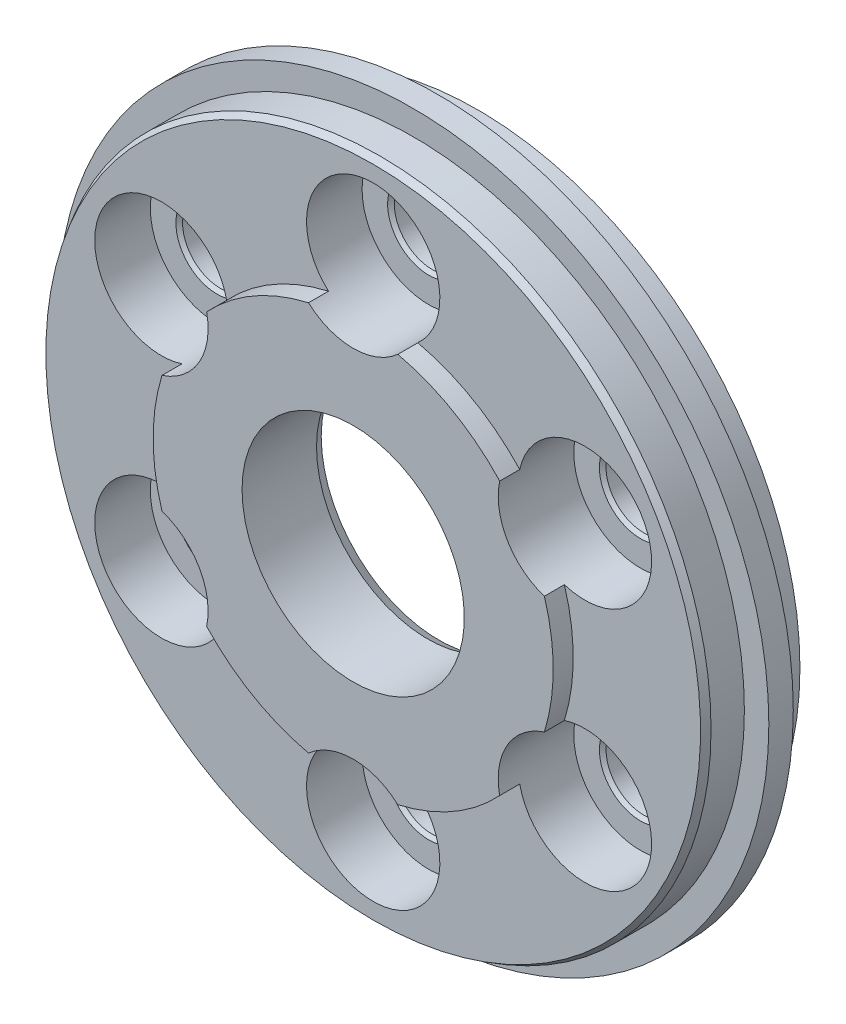
ISO-10303-21;
HEADER;
FILE_DESCRIPTION(('STEP AP214'),'2;1');
FILE_NAME('part.step','',(''),(''),'','','');
FILE_SCHEMA(('AUTOMOTIVE_DESIGN { 1 0 10303 214 1 1 1 1 }'));
ENDSEC;
DATA;
#1=APPLICATION_CONTEXT('core data for automotive mechanical design processes');
#2=APPLICATION_PROTOCOL_DEFINITION('international standard','automotive_design',2000,#1);
#3=PRODUCT_CONTEXT('',#1,'mechanical');
#4=PRODUCT('Part','Part','',(#3));
#5=PRODUCT_RELATED_PRODUCT_CATEGORY('part','',(#4));
#6=PRODUCT_DEFINITION_FORMATION('','',#4);
#7=PRODUCT_DEFINITION_CONTEXT('part definition',#1,'design');
#8=PRODUCT_DEFINITION('design','',#6,#7);
#9=PRODUCT_DEFINITION_SHAPE('','',#8);
#10=(LENGTH_UNIT() NAMED_UNIT(*) SI_UNIT(.MILLI.,.METRE.));
#11=(NAMED_UNIT(*) PLANE_ANGLE_UNIT() SI_UNIT($,.RADIAN.));
#12=(NAMED_UNIT(*) SI_UNIT($,.STERADIAN.) SOLID_ANGLE_UNIT());
#13=UNCERTAINTY_MEASURE_WITH_UNIT(LENGTH_MEASURE(1.E-05),#10,'distance_accuracy_value','');
#14=(GEOMETRIC_REPRESENTATION_CONTEXT(3) GLOBAL_UNCERTAINTY_ASSIGNED_CONTEXT((#13)) GLOBAL_UNIT_ASSIGNED_CONTEXT((#10,
#11,#12)) REPRESENTATION_CONTEXT('',''));
#15=CARTESIAN_POINT('',(0.,0.,0.));
#16=DIRECTION('',(0.,0.,1.));
#17=DIRECTION('',(1.,0.,0.));
#18=AXIS2_PLACEMENT_3D('',#15,#16,#17);
#19=CARTESIAN_POINT('',(0.,0.,5.6));
#20=DIRECTION('',(0.,0.,-1.));
#21=DIRECTION('',(-1.,0.,0.));
#22=AXIS2_PLACEMENT_3D('',#19,#20,#21);
#23=CYLINDRICAL_SURFACE('',#22,9.);
#24=DIRECTION('',(0.,0.,-1.));
#25=VECTOR('',#24,1.);
#26=CARTESIAN_POINT('',(2.00979008813039,-8.77272727272727,5.6));
#27=LINE('',#26,#25);
#28=CARTESIAN_POINT('',(2.00979008813038,-8.77272727272727,5.6));
#29=VERTEX_POINT('',#28);
#30=CARTESIAN_POINT('',(2.00979008813038,-8.77272727272727,4.7));
#31=VERTEX_POINT('',#30);
#32=EDGE_CURVE('E194',#29,#31,#27,.T.);
#33=ORIENTED_EDGE('',*,*,#32,.T.);
#34=CARTESIAN_POINT('',(0.,0.,4.7));
#35=DIRECTION('',(0.,0.,-1.));
#36=DIRECTION('',(-1.,0.,0.));
#37=AXIS2_PLACEMENT_3D('',#34,#35,#36);
#38=CIRCLE('',#37,9.);
#39=CARTESIAN_POINT('',(6.59250963458919,-6.12689290895873,4.7));
#40=VERTEX_POINT('',#39);
#41=EDGE_CURVE('E121',#31,#40,#38,.F.);
#42=ORIENTED_EDGE('',*,*,#41,.T.);
#43=DIRECTION('',(0.,0.,-1.));
#44=VECTOR('',#43,1.);
#45=CARTESIAN_POINT('',(6.59250963458919,-6.12689290895873,5.6));
#46=LINE('',#45,#44);
#47=CARTESIAN_POINT('',(6.59250963458919,-6.12689290895873,5.6));
#48=VERTEX_POINT('',#47);
#49=EDGE_CURVE('E193',#40,#48,#46,.F.);
#50=ORIENTED_EDGE('',*,*,#49,.T.);
#51=CARTESIAN_POINT('',(0.,0.,5.6));
#52=DIRECTION('',(0.,0.,-1.));
#53=DIRECTION('',(-1.,0.,0.));
#54=AXIS2_PLACEMENT_3D('',#51,#52,#53);
#55=CIRCLE('',#54,9.);
#56=EDGE_CURVE('E176',#29,#48,#55,.F.);
#57=ORIENTED_EDGE('',*,*,#56,.F.);
#58=EDGE_LOOP('',(#33,#42,#50,#57));
#59=FACE_BOUND('',#58,.T.);
#60=ADVANCED_FACE('F16',(#59),#23,.T.);
#61=CARTESIAN_POINT('',(0.,0.,5.6));
#62=DIRECTION('',(0.,0.,-1.));
#63=DIRECTION('',(-1.,0.,0.));
#64=AXIS2_PLACEMENT_3D('',#61,#62,#63);
#65=CYLINDRICAL_SURFACE('',#64,9.);
#66=DIRECTION('',(0.,0.,-1.));
#67=VECTOR('',#66,1.);
#68=CARTESIAN_POINT('',(8.60229972271959,2.64583436376853,5.6));
#69=LINE('',#68,#67);
#70=CARTESIAN_POINT('',(8.60229972271959,2.64583436376853,4.7));
#71=VERTEX_POINT('',#70);
#72=CARTESIAN_POINT('',(8.60229972271959,2.64583436376853,5.6));
#73=VERTEX_POINT('',#72);
#74=EDGE_CURVE('E308',#71,#73,#69,.F.);
#75=ORIENTED_EDGE('',*,*,#74,.T.);
#76=CARTESIAN_POINT('',(0.,0.,5.6));
#77=DIRECTION('',(0.,0.,-1.));
#78=DIRECTION('',(-1.,0.,0.));
#79=AXIS2_PLACEMENT_3D('',#76,#77,#78);
#80=CIRCLE('',#79,9.);
#81=CARTESIAN_POINT('',(8.60229972271957,-2.64583436376859,5.6));
#82=VERTEX_POINT('',#81);
#83=EDGE_CURVE('E173',#82,#73,#80,.F.);
#84=ORIENTED_EDGE('',*,*,#83,.F.);
#85=DIRECTION('',(0.,0.,-1.));
#86=VECTOR('',#85,1.);
#87=CARTESIAN_POINT('',(8.60229972271957,-2.64583436376859,5.6));
#88=LINE('',#87,#86);
#89=CARTESIAN_POINT('',(8.60229972271957,-2.64583436376859,4.7));
#90=VERTEX_POINT('',#89);
#91=EDGE_CURVE('E201',#82,#90,#88,.T.);
#92=ORIENTED_EDGE('',*,*,#91,.T.);
#93=CARTESIAN_POINT('',(0.,0.,4.7));
#94=DIRECTION('',(0.,0.,-1.));
#95=DIRECTION('',(-1.,0.,0.));
#96=AXIS2_PLACEMENT_3D('',#93,#94,#95);
#97=CIRCLE('',#96,9.);
#98=EDGE_CURVE('E187',#90,#71,#97,.F.);
#99=ORIENTED_EDGE('',*,*,#98,.T.);
#100=EDGE_LOOP('',(#75,#84,#92,#99));
#101=FACE_BOUND('',#100,.T.);
#102=ADVANCED_FACE('F310',(#101),#65,.T.);
#103=CARTESIAN_POINT('',(0.,0.,5.6));
#104=DIRECTION('',(0.,0.,-1.));
#105=DIRECTION('',(-1.,0.,0.));
#106=AXIS2_PLACEMENT_3D('',#103,#104,#105);
#107=CYLINDRICAL_SURFACE('',#106,9.);
#108=DIRECTION('',(0.,0.,-1.));
#109=VECTOR('',#108,1.);
#110=CARTESIAN_POINT('',(6.59250963458923,6.12689290895868,5.6));
#111=LINE('',#110,#109);
#112=CARTESIAN_POINT('',(6.59250963458923,6.12689290895868,5.6));
#113=VERTEX_POINT('',#112);
#114=CARTESIAN_POINT('',(6.59250963458923,6.12689290895868,4.7));
#115=VERTEX_POINT('',#114);
#116=EDGE_CURVE('E305',#113,#115,#111,.T.);
#117=ORIENTED_EDGE('',*,*,#116,.T.);
#118=CARTESIAN_POINT('',(0.,0.,4.7));
#119=DIRECTION('',(0.,0.,-1.));
#120=DIRECTION('',(-1.,0.,0.));
#121=AXIS2_PLACEMENT_3D('',#118,#119,#120);
#122=CIRCLE('',#121,9.);
#123=CARTESIAN_POINT('',(2.00979008813038,8.77272727272727,4.7));
#124=VERTEX_POINT('',#123);
#125=EDGE_CURVE('E184',#115,#124,#122,.F.);
#126=ORIENTED_EDGE('',*,*,#125,.T.);
#127=DIRECTION('',(0.,0.,-1.));
#128=VECTOR('',#127,1.);
#129=CARTESIAN_POINT('',(2.00979008813038,8.77272727272727,5.6));
#130=LINE('',#129,#128);
#131=CARTESIAN_POINT('',(2.00979008813038,8.77272727272727,5.6));
#132=VERTEX_POINT('',#131);
#133=EDGE_CURVE('E306',#124,#132,#130,.F.);
#134=ORIENTED_EDGE('',*,*,#133,.T.);
#135=CARTESIAN_POINT('',(0.,0.,5.6));
#136=DIRECTION('',(0.,0.,-1.));
#137=DIRECTION('',(-1.,0.,0.));
#138=AXIS2_PLACEMENT_3D('',#135,#136,#137);
#139=CIRCLE('',#138,9.);
#140=EDGE_CURVE('E170',#113,#132,#139,.F.);
#141=ORIENTED_EDGE('',*,*,#140,.F.);
#142=EDGE_LOOP('',(#117,#126,#134,#141));
#143=FACE_BOUND('',#142,.T.);
#144=ADVANCED_FACE('F485',(#143),#107,.T.);
#145=CARTESIAN_POINT('',(0.,0.,5.6));
#146=DIRECTION('',(0.,0.,-1.));
#147=DIRECTION('',(-1.,0.,0.));
#148=AXIS2_PLACEMENT_3D('',#145,#146,#147);
#149=CYLINDRICAL_SURFACE('',#148,9.);
#150=DIRECTION('',(0.,0.,-1.));
#151=VECTOR('',#150,1.);
#152=CARTESIAN_POINT('',(-6.5925096345892,6.12689290895872,5.6));
#153=LINE('',#152,#151);
#154=CARTESIAN_POINT('',(-6.5925096345892,6.12689290895872,4.7));
#155=VERTEX_POINT('',#154);
#156=CARTESIAN_POINT('',(-6.5925096345892,6.12689290895872,5.6));
#157=VERTEX_POINT('',#156);
#158=EDGE_CURVE('E300',#155,#157,#153,.F.);
#159=ORIENTED_EDGE('',*,*,#158,.T.);
#160=CARTESIAN_POINT('',(0.,0.,5.6));
#161=DIRECTION('',(0.,0.,-1.));
#162=DIRECTION('',(-1.,0.,0.));
#163=AXIS2_PLACEMENT_3D('',#160,#161,#162);
#164=CIRCLE('',#163,9.);
#165=CARTESIAN_POINT('',(-2.00979008813038,8.77272727272727,5.6));
#166=VERTEX_POINT('',#165);
#167=EDGE_CURVE('E167',#166,#157,#164,.F.);
#168=ORIENTED_EDGE('',*,*,#167,.F.);
#169=DIRECTION('',(0.,0.,-1.));
#170=VECTOR('',#169,1.);
#171=CARTESIAN_POINT('',(-2.00979008813038,8.77272727272727,5.6));
#172=LINE('',#171,#170);
#173=CARTESIAN_POINT('',(-2.00979008813038,8.77272727272727,4.7));
#174=VERTEX_POINT('',#173);
#175=EDGE_CURVE('E303',#166,#174,#172,.T.);
#176=ORIENTED_EDGE('',*,*,#175,.T.);
#177=CARTESIAN_POINT('',(0.,0.,4.7));
#178=DIRECTION('',(0.,0.,-1.));
#179=DIRECTION('',(-1.,0.,0.));
#180=AXIS2_PLACEMENT_3D('',#177,#178,#179);
#181=CIRCLE('',#180,9.);
#182=EDGE_CURVE('E181',#174,#155,#181,.F.);
#183=ORIENTED_EDGE('',*,*,#182,.T.);
#184=EDGE_LOOP('',(#159,#168,#176,#183));
#185=FACE_BOUND('',#184,.T.);
#186=ADVANCED_FACE('F481',(#185),#149,.T.);
#187=CARTESIAN_POINT('',(0.,0.,5.6));
#188=DIRECTION('',(0.,0.,-1.));
#189=DIRECTION('',(-1.,0.,0.));
#190=AXIS2_PLACEMENT_3D('',#187,#188,#189);
#191=CYLINDRICAL_SURFACE('',#190,9.);
#192=DIRECTION('',(0.,0.,-1.));
#193=VECTOR('',#192,1.);
#194=CARTESIAN_POINT('',(-8.60229972271958,2.64583436376856,5.6));
#195=LINE('',#194,#193);
#196=CARTESIAN_POINT('',(-8.60229972271958,2.64583436376856,5.6));
#197=VERTEX_POINT('',#196);
#198=CARTESIAN_POINT('',(-8.60229972271958,2.64583436376856,4.7));
#199=VERTEX_POINT('',#198);
#200=EDGE_CURVE('E109',#197,#199,#195,.T.);
#201=ORIENTED_EDGE('',*,*,#200,.T.);
#202=CARTESIAN_POINT('',(0.,0.,4.7));
#203=DIRECTION('',(0.,0.,-1.));
#204=DIRECTION('',(-1.,0.,0.));
#205=AXIS2_PLACEMENT_3D('',#202,#203,#204);
#206=CIRCLE('',#205,9.);
#207=CARTESIAN_POINT('',(-8.60229972271959,-2.64583436376856,4.7));
#208=VERTEX_POINT('',#207);
#209=EDGE_CURVE('E179',#199,#208,#206,.F.);
#210=ORIENTED_EDGE('',*,*,#209,.T.);
#211=DIRECTION('',(0.,0.,-1.));
#212=VECTOR('',#211,1.);
#213=CARTESIAN_POINT('',(-8.60229972271958,-2.64583436376856,5.6));
#214=LINE('',#213,#212);
#215=CARTESIAN_POINT('',(-8.60229972271959,-2.64583436376856,5.6));
#216=VERTEX_POINT('',#215);
#217=EDGE_CURVE('E124',#208,#216,#214,.F.);
#218=ORIENTED_EDGE('',*,*,#217,.T.);
#219=CARTESIAN_POINT('',(0.,0.,5.6));
#220=DIRECTION('',(0.,0.,-1.));
#221=DIRECTION('',(-1.,0.,0.));
#222=AXIS2_PLACEMENT_3D('',#219,#220,#221);
#223=CIRCLE('',#222,9.);
#224=EDGE_CURVE('E164',#197,#216,#223,.F.);
#225=ORIENTED_EDGE('',*,*,#224,.F.);
#226=EDGE_LOOP('',(#201,#210,#218,#225));
#227=FACE_BOUND('',#226,.T.);
#228=ADVANCED_FACE('F478',(#227),#191,.T.);
#229=CARTESIAN_POINT('',(0.,0.,5.6));
#230=DIRECTION('',(0.,0.,-1.));
#231=DIRECTION('',(-1.,0.,0.));
#232=AXIS2_PLACEMENT_3D('',#229,#230,#231);
#233=CYLINDRICAL_SURFACE('',#232,9.);
#234=DIRECTION('',(0.,0.,-1.));
#235=VECTOR('',#234,1.);
#236=CARTESIAN_POINT('',(-2.00979008813037,-8.77272727272727,5.6));
#237=LINE('',#236,#235);
#238=CARTESIAN_POINT('',(-2.00979008813038,-8.77272727272727,4.7));
#239=VERTEX_POINT('',#238);
#240=CARTESIAN_POINT('',(-2.00979008813038,-8.77272727272727,5.6));
#241=VERTEX_POINT('',#240);
#242=EDGE_CURVE('E108',#239,#241,#237,.F.);
#243=ORIENTED_EDGE('',*,*,#242,.T.);
#244=CARTESIAN_POINT('',(0.,0.,5.6));
#245=DIRECTION('',(0.,0.,-1.));
#246=DIRECTION('',(-1.,0.,0.));
#247=AXIS2_PLACEMENT_3D('',#244,#245,#246);
#248=CIRCLE('',#247,9.);
#249=CARTESIAN_POINT('',(-6.59250963458921,-6.1268929089587,5.6));
#250=VERTEX_POINT('',#249);
#251=EDGE_CURVE('E106',#250,#241,#248,.F.);
#252=ORIENTED_EDGE('',*,*,#251,.F.);
#253=DIRECTION('',(0.,0.,-1.));
#254=VECTOR('',#253,1.);
#255=CARTESIAN_POINT('',(-6.59250963458921,-6.12689290895871,5.6));
#256=LINE('',#255,#254);
#257=CARTESIAN_POINT('',(-6.59250963458921,-6.1268929089587,4.7));
#258=VERTEX_POINT('',#257);
#259=EDGE_CURVE('E34',#250,#258,#256,.T.);
#260=ORIENTED_EDGE('',*,*,#259,.T.);
#261=CARTESIAN_POINT('',(0.,0.,4.7));
#262=DIRECTION('',(0.,0.,-1.));
#263=DIRECTION('',(-1.,0.,0.));
#264=AXIS2_PLACEMENT_3D('',#261,#262,#263);
#265=CIRCLE('',#264,9.);
#266=EDGE_CURVE('E103',#258,#239,#265,.F.);
#267=ORIENTED_EDGE('',*,*,#266,.T.);
#268=EDGE_LOOP('',(#243,#252,#260,#267));
#269=FACE_BOUND('',#268,.T.);
#270=ADVANCED_FACE('F102',(#269),#233,.T.);
#271=CARTESIAN_POINT('',(0.,0.,4.39999999989637));
#272=DIRECTION('',(0.,0.,-1.));
#273=DIRECTION('',(0.,1.,0.));
#274=AXIS2_PLACEMENT_3D('',#271,#272,#273);
#275=CONICAL_SURFACE('',#274,14.8999999998205,0.523598775000003);
#276=CARTESIAN_POINT('',(0.,0.,4.7));
#277=DIRECTION('',(0.,0.,-1.));
#278=DIRECTION('',(0.,1.,0.));
#279=AXIS2_PLACEMENT_3D('',#276,#277,#278);
#280=CIRCLE('',#279,14.7267949192431);
#281=CARTESIAN_POINT('',(0.,14.7267949192431,4.7));
#282=VERTEX_POINT('',#281);
#283=EDGE_CURVE('E19',#282,#282,#280,.T.);
#284=ORIENTED_EDGE('',*,*,#283,.T.);
#285=EDGE_LOOP('',(#284));
#286=FACE_BOUND('',#285,.T.);
#287=CARTESIAN_POINT('',(0.,0.,4.4));
#288=DIRECTION('',(0.,0.,1.));
#289=DIRECTION('',(1.,0.,0.));
#290=AXIS2_PLACEMENT_3D('',#287,#288,#289);
#291=CIRCLE('',#290,14.9);
#292=CARTESIAN_POINT('',(14.9,0.,4.4));
#293=VERTEX_POINT('',#292);
#294=EDGE_CURVE('E159',#293,#293,#291,.F.);
#295=ORIENTED_EDGE('',*,*,#294,.F.);
#296=EDGE_LOOP('',(#295));
#297=FACE_BOUND('',#296,.T.);
#298=ADVANCED_FACE('F472',(#286,#297),#275,.T.);
#299=CARTESIAN_POINT('',(0.,0.,4.7));
#300=DIRECTION('',(0.,0.,-1.));
#301=DIRECTION('',(-1.,0.,0.));
#302=AXIS2_PLACEMENT_3D('',#299,#300,#301);
#303=PLANE('',#302);
#304=CARTESIAN_POINT('',(-9.52627944162882,5.5,4.7));
#305=DIRECTION('',(0.,0.,-1.));
#306=DIRECTION('',(-1.,0.,0.));
#307=AXIS2_PLACEMENT_3D('',#304,#305,#306);
#308=CIRCLE('',#307,3.);
#309=EDGE_CURVE('E157',#199,#155,#308,.T.);
#310=ORIENTED_EDGE('',*,*,#309,.T.);
#311=ORIENTED_EDGE('',*,*,#182,.F.);
#312=CARTESIAN_POINT('',(0.,11.,4.7));
#313=DIRECTION('',(0.,0.,-1.));
#314=DIRECTION('',(-1.,0.,0.));
#315=AXIS2_PLACEMENT_3D('',#312,#313,#314);
#316=CIRCLE('',#315,3.);
#317=EDGE_CURVE('E132',#174,#124,#316,.T.);
#318=ORIENTED_EDGE('',*,*,#317,.T.);
#319=ORIENTED_EDGE('',*,*,#125,.F.);
#320=CARTESIAN_POINT('',(9.52627944162885,5.49999999999996,4.7));
#321=DIRECTION('',(0.,0.,-1.));
#322=DIRECTION('',(-1.,0.,0.));
#323=AXIS2_PLACEMENT_3D('',#320,#321,#322);
#324=CIRCLE('',#323,3.);
#325=EDGE_CURVE('E147',#115,#71,#324,.T.);
#326=ORIENTED_EDGE('',*,*,#325,.T.);
#327=ORIENTED_EDGE('',*,*,#98,.F.);
#328=CARTESIAN_POINT('',(9.52627944162881,-5.50000000000003,4.7));
#329=DIRECTION('',(0.,0.,-1.));
#330=DIRECTION('',(-1.,0.,0.));
#331=AXIS2_PLACEMENT_3D('',#328,#329,#330);
#332=CIRCLE('',#331,3.);
#333=EDGE_CURVE('E141',#90,#40,#332,.T.);
#334=ORIENTED_EDGE('',*,*,#333,.T.);
#335=ORIENTED_EDGE('',*,*,#41,.F.);
#336=CARTESIAN_POINT('',(0.,-11.,4.7));
#337=DIRECTION('',(0.,0.,-1.));
#338=DIRECTION('',(-1.,0.,0.));
#339=AXIS2_PLACEMENT_3D('',#336,#337,#338);
#340=CIRCLE('',#339,3.);
#341=EDGE_CURVE('E120',#31,#239,#340,.T.);
#342=ORIENTED_EDGE('',*,*,#341,.T.);
#343=ORIENTED_EDGE('',*,*,#266,.F.);
#344=CARTESIAN_POINT('',(-9.52627944162883,-5.49999999999999,4.7));
#345=DIRECTION('',(0.,0.,-1.));
#346=DIRECTION('',(-1.,0.,0.));
#347=AXIS2_PLACEMENT_3D('',#344,#345,#346);
#348=CIRCLE('',#347,3.);
#349=EDGE_CURVE('E117',#258,#208,#348,.T.);
#350=ORIENTED_EDGE('',*,*,#349,.T.);
#351=ORIENTED_EDGE('',*,*,#209,.F.);
#352=EDGE_LOOP('',(#310,#311,#318,#319,#326,#327,#334,#335,#342,#343,#350,#351));
#353=FACE_BOUND('',#352,.T.);
#354=ORIENTED_EDGE('',*,*,#283,.F.);
#355=EDGE_LOOP('',(#354));
#356=FACE_BOUND('',#355,.T.);
#357=ADVANCED_FACE('F114',(#353,#356),#303,.F.);
#358=CARTESIAN_POINT('',(0.,0.,5.6));
#359=DIRECTION('',(0.,0.,1.));
#360=DIRECTION('',(1.,0.,0.));
#361=AXIS2_PLACEMENT_3D('',#358,#359,#360);
#362=PLANE('',#361);
#363=CARTESIAN_POINT('',(0.,0.,5.6));
#364=DIRECTION('',(0.,0.,-1.));
#365=DIRECTION('',(-1.,0.,0.));
#366=AXIS2_PLACEMENT_3D('',#363,#364,#365);
#367=CIRCLE('',#366,5.);
#368=CARTESIAN_POINT('',(-5.,0.,5.6));
#369=VERTEX_POINT('',#368);
#370=EDGE_CURVE('E160',#369,#369,#367,.T.);
#371=ORIENTED_EDGE('',*,*,#370,.T.);
#372=EDGE_LOOP('',(#371));
#373=FACE_BOUND('',#372,.T.);
#374=ORIENTED_EDGE('',*,*,#251,.T.);
#375=CARTESIAN_POINT('',(0.,-11.,5.6));
#376=DIRECTION('',(0.,0.,-1.));
#377=DIRECTION('',(-1.,0.,0.));
#378=AXIS2_PLACEMENT_3D('',#375,#376,#377);
#379=CIRCLE('',#378,3.);
#380=EDGE_CURVE('E150',#241,#29,#379,.T.);
#381=ORIENTED_EDGE('',*,*,#380,.T.);
#382=ORIENTED_EDGE('',*,*,#56,.T.);
#383=CARTESIAN_POINT('',(9.52627944162881,-5.50000000000003,5.6));
#384=DIRECTION('',(0.,0.,-1.));
#385=DIRECTION('',(-1.,0.,0.));
#386=AXIS2_PLACEMENT_3D('',#383,#384,#385);
#387=CIRCLE('',#386,3.);
#388=EDGE_CURVE('E138',#48,#82,#387,.T.);
#389=ORIENTED_EDGE('',*,*,#388,.T.);
#390=ORIENTED_EDGE('',*,*,#83,.T.);
#391=CARTESIAN_POINT('',(9.52627944162885,5.49999999999996,5.6));
#392=DIRECTION('',(0.,0.,-1.));
#393=DIRECTION('',(-1.,0.,0.));
#394=AXIS2_PLACEMENT_3D('',#391,#392,#393);
#395=CIRCLE('',#394,3.);
#396=EDGE_CURVE('E144',#73,#113,#395,.T.);
#397=ORIENTED_EDGE('',*,*,#396,.T.);
#398=ORIENTED_EDGE('',*,*,#140,.T.);
#399=CARTESIAN_POINT('',(0.,11.,5.6));
#400=DIRECTION('',(0.,0.,-1.));
#401=DIRECTION('',(-1.,0.,0.));
#402=AXIS2_PLACEMENT_3D('',#399,#400,#401);
#403=CIRCLE('',#402,3.);
#404=EDGE_CURVE('E127',#132,#166,#403,.T.);
#405=ORIENTED_EDGE('',*,*,#404,.T.);
#406=ORIENTED_EDGE('',*,*,#167,.T.);
#407=CARTESIAN_POINT('',(-9.52627944162882,5.5,5.6));
#408=DIRECTION('',(0.,0.,-1.));
#409=DIRECTION('',(-1.,0.,0.));
#410=AXIS2_PLACEMENT_3D('',#407,#408,#409);
#411=CIRCLE('',#410,3.);
#412=EDGE_CURVE('E154',#157,#197,#411,.T.);
#413=ORIENTED_EDGE('',*,*,#412,.T.);
#414=ORIENTED_EDGE('',*,*,#224,.T.);
#415=CARTESIAN_POINT('',(-9.52627944162883,-5.49999999999999,5.6));
#416=DIRECTION('',(0.,0.,-1.));
#417=DIRECTION('',(-1.,0.,0.));
#418=AXIS2_PLACEMENT_3D('',#415,#416,#417);
#419=CIRCLE('',#418,3.);
#420=EDGE_CURVE('E126',#216,#250,#419,.T.);
#421=ORIENTED_EDGE('',*,*,#420,.T.);
#422=EDGE_LOOP('',(#374,#381,#382,#389,#390,#397,#398,#405,#406,#413,#414,#421));
#423=FACE_BOUND('',#422,.T.);
#424=ADVANCED_FACE('F313',(#373,#423),#362,.T.);
#425=CARTESIAN_POINT('',(0.,0.,0.));
#426=DIRECTION('',(0.,0.,-1.));
#427=DIRECTION('',(-1.,0.,0.));
#428=AXIS2_PLACEMENT_3D('',#425,#426,#427);
#429=CYLINDRICAL_SURFACE('',#428,5.);
#430=ORIENTED_EDGE('',*,*,#370,.F.);
#431=EDGE_LOOP('',(#430));
#432=FACE_BOUND('',#431,.T.);
#433=CARTESIAN_POINT('',(0.,0.,2.25000000000364));
#434=DIRECTION('',(0.,0.,-1.));
#435=DIRECTION('',(-1.,0.,0.));
#436=AXIS2_PLACEMENT_3D('',#433,#434,#435);
#437=CIRCLE('',#436,4.99999999999545);
#438=CARTESIAN_POINT('',(-4.99999999999545,0.,2.25000000000364));
#439=VERTEX_POINT('',#438);
#440=EDGE_CURVE('E129',#439,#439,#437,.T.);
#441=ORIENTED_EDGE('',*,*,#440,.T.);
#442=EDGE_LOOP('',(#441));
#443=FACE_BOUND('',#442,.T.);
#444=ADVANCED_FACE('F462',(#432,#443),#429,.F.);
#445=CARTESIAN_POINT('',(0.,0.,0.));
#446=DIRECTION('',(0.,0.,1.));
#447=DIRECTION('',(1.,0.,0.));
#448=AXIS2_PLACEMENT_3D('',#445,#446,#447);
#449=CYLINDRICAL_SURFACE('',#448,14.9);
#450=CARTESIAN_POINT('',(0.,0.,2.9));
#451=DIRECTION('',(0.,0.,1.));
#452=DIRECTION('',(1.,0.,0.));
#453=AXIS2_PLACEMENT_3D('',#450,#451,#452);
#454=CIRCLE('',#453,14.9);
#455=CARTESIAN_POINT('',(14.9,0.,2.9));
#456=VERTEX_POINT('',#455);
#457=EDGE_CURVE('E280',#456,#456,#454,.F.);
#458=ORIENTED_EDGE('',*,*,#457,.F.);
#459=EDGE_LOOP('',(#458));
#460=FACE_BOUND('',#459,.T.);
#461=ORIENTED_EDGE('',*,*,#294,.T.);
#462=EDGE_LOOP('',(#461));
#463=FACE_BOUND('',#462,.T.);
#464=ADVANCED_FACE('F458',(#460,#463),#449,.T.);
#465=CARTESIAN_POINT('',(-9.52627944162882,5.5,5.6));
#466=DIRECTION('',(0.,0.,-1.));
#467=DIRECTION('',(-1.,0.,0.));
#468=AXIS2_PLACEMENT_3D('',#465,#466,#467);
#469=CYLINDRICAL_SURFACE('',#468,3.);
#470=ORIENTED_EDGE('',*,*,#412,.F.);
#471=ORIENTED_EDGE('',*,*,#158,.F.);
#472=ORIENTED_EDGE('',*,*,#309,.F.);
#473=ORIENTED_EDGE('',*,*,#200,.F.);
#474=EDGE_LOOP('',(#470,#471,#472,#473));
#475=FACE_BOUND('',#474,.T.);
#476=CARTESIAN_POINT('',(-9.52627944162882,5.5,2.2));
#477=DIRECTION('',(0.,0.,-1.));
#478=DIRECTION('',(-1.,0.,0.));
#479=AXIS2_PLACEMENT_3D('',#476,#477,#478);
#480=CIRCLE('',#479,3.);
#481=CARTESIAN_POINT('',(-12.5262794416288,5.5,2.2));
#482=VERTEX_POINT('',#481);
#483=EDGE_CURVE('E278',#482,#482,#480,.T.);
#484=ORIENTED_EDGE('',*,*,#483,.T.);
#485=EDGE_LOOP('',(#484));
#486=FACE_BOUND('',#485,.T.);
#487=ADVANCED_FACE('F321',(#475,#486),#469,.F.);
#488=CARTESIAN_POINT('',(0.,-11.,5.6));
#489=DIRECTION('',(0.,0.,-1.));
#490=DIRECTION('',(-1.,0.,0.));
#491=AXIS2_PLACEMENT_3D('',#488,#489,#490);
#492=CYLINDRICAL_SURFACE('',#491,3.);
#493=ORIENTED_EDGE('',*,*,#380,.F.);
#494=ORIENTED_EDGE('',*,*,#242,.F.);
#495=ORIENTED_EDGE('',*,*,#341,.F.);
#496=ORIENTED_EDGE('',*,*,#32,.F.);
#497=EDGE_LOOP('',(#493,#494,#495,#496));
#498=FACE_BOUND('',#497,.T.);
#499=CARTESIAN_POINT('',(0.,-11.,2.2));
#500=DIRECTION('',(0.,0.,-1.));
#501=DIRECTION('',(-1.,0.,0.));
#502=AXIS2_PLACEMENT_3D('',#499,#500,#501);
#503=CIRCLE('',#502,3.);
#504=CARTESIAN_POINT('',(-3.,-11.,2.2));
#505=VERTEX_POINT('',#504);
#506=EDGE_CURVE('E275',#505,#505,#503,.T.);
#507=ORIENTED_EDGE('',*,*,#506,.T.);
#508=EDGE_LOOP('',(#507));
#509=FACE_BOUND('',#508,.T.);
#510=ADVANCED_FACE('F317',(#498,#509),#492,.F.);
#511=CARTESIAN_POINT('',(9.52627944162885,5.49999999999996,5.6));
#512=DIRECTION('',(0.,0.,-1.));
#513=DIRECTION('',(-1.,0.,0.));
#514=AXIS2_PLACEMENT_3D('',#511,#512,#513);
#515=CYLINDRICAL_SURFACE('',#514,3.);
#516=ORIENTED_EDGE('',*,*,#396,.F.);
#517=ORIENTED_EDGE('',*,*,#74,.F.);
#518=ORIENTED_EDGE('',*,*,#325,.F.);
#519=ORIENTED_EDGE('',*,*,#116,.F.);
#520=EDGE_LOOP('',(#516,#517,#518,#519));
#521=FACE_BOUND('',#520,.T.);
#522=CARTESIAN_POINT('',(9.52627944162885,5.49999999999996,2.2));
#523=DIRECTION('',(0.,0.,-1.));
#524=DIRECTION('',(-1.,0.,0.));
#525=AXIS2_PLACEMENT_3D('',#522,#523,#524);
#526=CIRCLE('',#525,3.);
#527=CARTESIAN_POINT('',(6.52627944162885,5.49999999999996,2.2));
#528=VERTEX_POINT('',#527);
#529=EDGE_CURVE('E272',#528,#528,#526,.T.);
#530=ORIENTED_EDGE('',*,*,#529,.T.);
#531=EDGE_LOOP('',(#530));
#532=FACE_BOUND('',#531,.T.);
#533=ADVANCED_FACE('F320',(#521,#532),#515,.F.);
#534=CARTESIAN_POINT('',(9.52627944162881,-5.50000000000003,5.6));
#535=DIRECTION('',(0.,0.,-1.));
#536=DIRECTION('',(-1.,0.,0.));
#537=AXIS2_PLACEMENT_3D('',#534,#535,#536);
#538=CYLINDRICAL_SURFACE('',#537,3.);
#539=ORIENTED_EDGE('',*,*,#388,.F.);
#540=ORIENTED_EDGE('',*,*,#49,.F.);
#541=ORIENTED_EDGE('',*,*,#333,.F.);
#542=ORIENTED_EDGE('',*,*,#91,.F.);
#543=EDGE_LOOP('',(#539,#540,#541,#542));
#544=FACE_BOUND('',#543,.T.);
#545=CARTESIAN_POINT('',(9.52627944162881,-5.50000000000003,2.2));
#546=DIRECTION('',(0.,0.,-1.));
#547=DIRECTION('',(-1.,0.,0.));
#548=AXIS2_PLACEMENT_3D('',#545,#546,#547);
#549=CIRCLE('',#548,3.);
#550=CARTESIAN_POINT('',(6.52627944162881,-5.50000000000003,2.2));
#551=VERTEX_POINT('',#550);
#552=EDGE_CURVE('E269',#551,#551,#549,.T.);
#553=ORIENTED_EDGE('',*,*,#552,.T.);
#554=EDGE_LOOP('',(#553));
#555=FACE_BOUND('',#554,.T.);
#556=ADVANCED_FACE('F199',(#544,#555),#538,.F.);
#557=CARTESIAN_POINT('',(0.,11.,5.6));
#558=DIRECTION('',(0.,0.,-1.));
#559=DIRECTION('',(-1.,0.,0.));
#560=AXIS2_PLACEMENT_3D('',#557,#558,#559);
#561=CYLINDRICAL_SURFACE('',#560,3.);
#562=ORIENTED_EDGE('',*,*,#404,.F.);
#563=ORIENTED_EDGE('',*,*,#133,.F.);
#564=ORIENTED_EDGE('',*,*,#317,.F.);
#565=ORIENTED_EDGE('',*,*,#175,.F.);
#566=EDGE_LOOP('',(#562,#563,#564,#565));
#567=FACE_BOUND('',#566,.T.);
#568=CARTESIAN_POINT('',(0.,11.,2.2));
#569=DIRECTION('',(0.,0.,-1.));
#570=DIRECTION('',(-1.,0.,0.));
#571=AXIS2_PLACEMENT_3D('',#568,#569,#570);
#572=CIRCLE('',#571,3.);
#573=CARTESIAN_POINT('',(-3.,11.,2.2));
#574=VERTEX_POINT('',#573);
#575=EDGE_CURVE('E266',#574,#574,#572,.T.);
#576=ORIENTED_EDGE('',*,*,#575,.T.);
#577=EDGE_LOOP('',(#576));
#578=FACE_BOUND('',#577,.T.);
#579=ADVANCED_FACE('F447',(#567,#578),#561,.F.);
#580=CARTESIAN_POINT('',(-9.52627944162883,-5.49999999999999,5.6));
#581=DIRECTION('',(0.,0.,-1.));
#582=DIRECTION('',(-1.,0.,0.));
#583=AXIS2_PLACEMENT_3D('',#580,#581,#582);
#584=CYLINDRICAL_SURFACE('',#583,3.);
#585=ORIENTED_EDGE('',*,*,#420,.F.);
#586=ORIENTED_EDGE('',*,*,#217,.F.);
#587=ORIENTED_EDGE('',*,*,#349,.F.);
#588=ORIENTED_EDGE('',*,*,#259,.F.);
#589=EDGE_LOOP('',(#585,#586,#587,#588));
#590=FACE_BOUND('',#589,.T.);
#591=CARTESIAN_POINT('',(-9.52627944162883,-5.49999999999999,2.2));
#592=DIRECTION('',(0.,0.,-1.));
#593=DIRECTION('',(-1.,0.,0.));
#594=AXIS2_PLACEMENT_3D('',#591,#592,#593);
#595=CIRCLE('',#594,3.);
#596=CARTESIAN_POINT('',(-12.5262794416288,-5.49999999999999,2.2));
#597=VERTEX_POINT('',#596);
#598=EDGE_CURVE('E263',#597,#597,#595,.T.);
#599=ORIENTED_EDGE('',*,*,#598,.T.);
#600=EDGE_LOOP('',(#599));
#601=FACE_BOUND('',#600,.T.);
#602=ADVANCED_FACE('F122',(#590,#601),#584,.F.);
#603=CARTESIAN_POINT('',(0.,0.,1.74999999995862));
#604=DIRECTION('',(0.,0.,-1.));
#605=DIRECTION('',(-1.,0.,0.));
#606=AXIS2_PLACEMENT_3D('',#603,#604,#605);
#607=CONICAL_SURFACE('',#606,5.28867513423847,0.523598775018433);
#608=ORIENTED_EDGE('',*,*,#440,.F.);
#609=EDGE_LOOP('',(#608));
#610=FACE_BOUND('',#609,.T.);
#611=CARTESIAN_POINT('',(0.,0.,1.74999999984493));
#612=DIRECTION('',(0.,0.,-1.));
#613=DIRECTION('',(-1.,0.,0.));
#614=AXIS2_PLACEMENT_3D('',#611,#612,#613);
#615=CIRCLE('',#614,5.28867513430411);
#616=CARTESIAN_POINT('',(-5.28867513430411,0.,1.74999999984493));
#617=VERTEX_POINT('',#616);
#618=EDGE_CURVE('E260',#617,#617,#615,.F.);
#619=ORIENTED_EDGE('',*,*,#618,.F.);
#620=EDGE_LOOP('',(#619));
#621=FACE_BOUND('',#620,.T.);
#622=ADVANCED_FACE('F440',(#610,#621),#607,.F.);
#623=CARTESIAN_POINT('',(0.,0.,2.9));
#624=DIRECTION('',(0.,0.,1.));
#625=DIRECTION('',(1.,0.,0.));
#626=AXIS2_PLACEMENT_3D('',#623,#624,#625);
#627=PLANE('',#626);
#628=CARTESIAN_POINT('',(0.,0.,2.9));
#629=DIRECTION('',(0.,0.,1.));
#630=DIRECTION('',(1.,0.,0.));
#631=AXIS2_PLACEMENT_3D('',#628,#629,#630);
#632=CIRCLE('',#631,16.);
#633=CARTESIAN_POINT('',(16.,0.,2.9));
#634=VERTEX_POINT('',#633);
#635=EDGE_CURVE('E257',#634,#634,#632,.F.);
#636=ORIENTED_EDGE('',*,*,#635,.F.);
#637=EDGE_LOOP('',(#636));
#638=FACE_BOUND('',#637,.T.);
#639=ORIENTED_EDGE('',*,*,#457,.T.);
#640=EDGE_LOOP('',(#639));
#641=FACE_BOUND('',#640,.T.);
#642=ADVANCED_FACE('F436',(#638,#641),#627,.T.);
#643=CARTESIAN_POINT('',(-9.52627944162882,5.5,2.2));
#644=DIRECTION('',(0.,0.,-1.));
#645=DIRECTION('',(-1.,0.,0.));
#646=AXIS2_PLACEMENT_3D('',#643,#644,#645);
#647=PLANE('',#646);
#648=ORIENTED_EDGE('',*,*,#483,.F.);
#649=EDGE_LOOP('',(#648));
#650=FACE_BOUND('',#649,.T.);
#651=CARTESIAN_POINT('',(-9.52627944162882,5.5,2.20000000007303));
#652=DIRECTION('',(0.,0.,1.));
#653=DIRECTION('',(1.,0.,0.));
#654=AXIS2_PLACEMENT_3D('',#651,#652,#653);
#655=CIRCLE('',#654,1.84999999983288);
#656=CARTESIAN_POINT('',(-7.67627944179594,5.5,2.20000000007303));
#657=VERTEX_POINT('',#656);
#658=EDGE_CURVE('E254',#657,#657,#655,.F.);
#659=ORIENTED_EDGE('',*,*,#658,.T.);
#660=EDGE_LOOP('',(#659));
#661=FACE_BOUND('',#660,.T.);
#662=ADVANCED_FACE('F329',(#650,#661),#647,.F.);
#663=CARTESIAN_POINT('',(0.,-11.,2.2));
#664=DIRECTION('',(0.,0.,-1.));
#665=DIRECTION('',(-1.,0.,0.));
#666=AXIS2_PLACEMENT_3D('',#663,#664,#665);
#667=PLANE('',#666);
#668=ORIENTED_EDGE('',*,*,#506,.F.);
#669=EDGE_LOOP('',(#668));
#670=FACE_BOUND('',#669,.T.);
#671=CARTESIAN_POINT('',(0.,-11.,2.20000000012988));
#672=DIRECTION('',(0.,0.,1.));
#673=DIRECTION('',(1.,0.,0.));
#674=AXIS2_PLACEMENT_3D('',#671,#672,#673);
#675=CIRCLE('',#674,1.84999999987667);
#676=CARTESIAN_POINT('',(1.84999999987667,-11.,2.20000000012988));
#677=VERTEX_POINT('',#676);
#678=EDGE_CURVE('E251',#677,#677,#675,.F.);
#679=ORIENTED_EDGE('',*,*,#678,.T.);
#680=EDGE_LOOP('',(#679));
#681=FACE_BOUND('',#680,.T.);
#682=ADVANCED_FACE('F325',(#670,#681),#667,.F.);
#683=CARTESIAN_POINT('',(9.52627944162885,5.49999999999996,2.2));
#684=DIRECTION('',(0.,0.,-1.));
#685=DIRECTION('',(-1.,0.,0.));
#686=AXIS2_PLACEMENT_3D('',#683,#684,#685);
#687=PLANE('',#686);
#688=ORIENTED_EDGE('',*,*,#529,.F.);
#689=EDGE_LOOP('',(#688));
#690=FACE_BOUND('',#689,.T.);
#691=CARTESIAN_POINT('',(9.52627944162885,5.49999999999996,2.20000000007303));
#692=DIRECTION('',(0.,0.,1.));
#693=DIRECTION('',(1.,0.,0.));
#694=AXIS2_PLACEMENT_3D('',#691,#692,#693);
#695=CIRCLE('',#694,1.84999999986359);
#696=CARTESIAN_POINT('',(11.3762794414924,5.49999999999996,2.20000000007303));
#697=VERTEX_POINT('',#696);
#698=EDGE_CURVE('E248',#697,#697,#695,.F.);
#699=ORIENTED_EDGE('',*,*,#698,.T.);
#700=EDGE_LOOP('',(#699));
#701=FACE_BOUND('',#700,.T.);
#702=ADVANCED_FACE('F328',(#690,#701),#687,.F.);
#703=CARTESIAN_POINT('',(9.52627944162881,-5.50000000000003,2.2));
#704=DIRECTION('',(0.,0.,-1.));
#705=DIRECTION('',(-1.,0.,0.));
#706=AXIS2_PLACEMENT_3D('',#703,#704,#705);
#707=PLANE('',#706);
#708=ORIENTED_EDGE('',*,*,#552,.F.);
#709=EDGE_LOOP('',(#708));
#710=FACE_BOUND('',#709,.T.);
#711=CARTESIAN_POINT('',(9.52627944162881,-5.50000000000003,2.20000000007303));
#712=DIRECTION('',(0.,0.,1.));
#713=DIRECTION('',(1.,0.,0.));
#714=AXIS2_PLACEMENT_3D('',#711,#712,#713);
#715=CIRCLE('',#714,1.84999999986363);
#716=CARTESIAN_POINT('',(11.3762794414924,-5.50000000000003,2.20000000007303));
#717=VERTEX_POINT('',#716);
#718=EDGE_CURVE('E245',#717,#717,#715,.F.);
#719=ORIENTED_EDGE('',*,*,#718,.T.);
#720=EDGE_LOOP('',(#719));
#721=FACE_BOUND('',#720,.T.);
#722=ADVANCED_FACE('F417',(#710,#721),#707,.F.);
#723=CARTESIAN_POINT('',(0.,11.,2.2));
#724=DIRECTION('',(0.,0.,-1.));
#725=DIRECTION('',(-1.,0.,0.));
#726=AXIS2_PLACEMENT_3D('',#723,#724,#725);
#727=PLANE('',#726);
#728=ORIENTED_EDGE('',*,*,#575,.F.);
#729=EDGE_LOOP('',(#728));
#730=FACE_BOUND('',#729,.T.);
#731=CARTESIAN_POINT('',(0.,11.,2.20000000012988));
#732=DIRECTION('',(0.,0.,1.));
#733=DIRECTION('',(1.,0.,0.));
#734=AXIS2_PLACEMENT_3D('',#731,#732,#733);
#735=CIRCLE('',#734,1.84999999987667);
#736=CARTESIAN_POINT('',(1.84999999987667,11.,2.20000000012988));
#737=VERTEX_POINT('',#736);
#738=EDGE_CURVE('E242',#737,#737,#735,.F.);
#739=ORIENTED_EDGE('',*,*,#738,.T.);
#740=EDGE_LOOP('',(#739));
#741=FACE_BOUND('',#740,.T.);
#742=ADVANCED_FACE('F419',(#730,#741),#727,.F.);
#743=CARTESIAN_POINT('',(-9.52627944162883,-5.49999999999999,2.2));
#744=DIRECTION('',(0.,0.,-1.));
#745=DIRECTION('',(-1.,0.,0.));
#746=AXIS2_PLACEMENT_3D('',#743,#744,#745);
#747=PLANE('',#746);
#748=ORIENTED_EDGE('',*,*,#598,.F.);
#749=EDGE_LOOP('',(#748));
#750=FACE_BOUND('',#749,.T.);
#751=CARTESIAN_POINT('',(-9.52627944162883,-5.49999999999999,2.20000000007303));
#752=DIRECTION('',(0.,0.,1.));
#753=DIRECTION('',(1.,0.,0.));
#754=AXIS2_PLACEMENT_3D('',#751,#752,#753);
#755=CIRCLE('',#754,1.84999999983289);
#756=CARTESIAN_POINT('',(-7.67627944179594,-5.49999999999999,2.20000000007303));
#757=VERTEX_POINT('',#756);
#758=EDGE_CURVE('E239',#757,#757,#755,.F.);
#759=ORIENTED_EDGE('',*,*,#758,.T.);
#760=EDGE_LOOP('',(#759));
#761=FACE_BOUND('',#760,.T.);
#762=ADVANCED_FACE('F426',(#750,#761),#747,.F.);
#763=CARTESIAN_POINT('',(5.,0.,1.75));
#764=DIRECTION('',(0.,0.,-1.));
#765=DIRECTION('',(-1.,0.,0.));
#766=AXIS2_PLACEMENT_3D('',#763,#764,#765);
#767=PLANE('',#766);
#768=CARTESIAN_POINT('',(0.,0.,1.75));
#769=DIRECTION('',(0.,0.,-1.));
#770=DIRECTION('',(-1.,0.,0.));
#771=AXIS2_PLACEMENT_3D('',#768,#769,#770);
#772=CIRCLE('',#771,8.);
#773=CARTESIAN_POINT('',(-8.,0.,1.75));
#774=VERTEX_POINT('',#773);
#775=EDGE_CURVE('E236',#774,#774,#772,.T.);
#776=ORIENTED_EDGE('',*,*,#775,.T.);
#777=EDGE_LOOP('',(#776));
#778=FACE_BOUND('',#777,.T.);
#779=ORIENTED_EDGE('',*,*,#618,.T.);
#780=EDGE_LOOP('',(#779));
#781=FACE_BOUND('',#780,.T.);
#782=ADVANCED_FACE('F643',(#778,#781),#767,.T.);
#783=CARTESIAN_POINT('',(0.,0.,0.));
#784=DIRECTION('',(0.,0.,1.));
#785=DIRECTION('',(1.,0.,0.));
#786=AXIS2_PLACEMENT_3D('',#783,#784,#785);
#787=CYLINDRICAL_SURFACE('',#786,16.);
#788=ORIENTED_EDGE('',*,*,#635,.T.);
#789=EDGE_LOOP('',(#788));
#790=FACE_BOUND('',#789,.T.);
#791=CARTESIAN_POINT('',(0.,0.,1.8));
#792=DIRECTION('',(0.,0.,1.));
#793=DIRECTION('',(1.,0.,0.));
#794=AXIS2_PLACEMENT_3D('',#791,#792,#793);
#795=CIRCLE('',#794,16.);
#796=CARTESIAN_POINT('',(16.,0.,1.8));
#797=VERTEX_POINT('',#796);
#798=EDGE_CURVE('E232',#797,#797,#795,.T.);
#799=ORIENTED_EDGE('',*,*,#798,.T.);
#800=EDGE_LOOP('',(#799));
#801=FACE_BOUND('',#800,.T.);
#802=ADVANCED_FACE('F347',(#790,#801),#787,.T.);
#803=CARTESIAN_POINT('',(-9.52627944162882,5.5,2.1999999999025));
#804=DIRECTION('',(0.,0.,1.));
#805=DIRECTION('',(1.,0.,0.));
#806=AXIS2_PLACEMENT_3D('',#803,#804,#805);
#807=CONICAL_SURFACE('',#806,1.84999999966235,0.785398162450058);
#808=CARTESIAN_POINT('',(-9.52627944162882,5.5,2.05));
#809=DIRECTION('',(0.,0.,-1.));
#810=DIRECTION('',(-1.,0.,0.));
#811=AXIS2_PLACEMENT_3D('',#808,#809,#810);
#812=CIRCLE('',#811,1.7);
#813=CARTESIAN_POINT('',(-11.2262794416288,5.5,2.05));
#814=VERTEX_POINT('',#813);
#815=EDGE_CURVE('E235',#814,#814,#812,.T.);
#816=ORIENTED_EDGE('',*,*,#815,.T.);
#817=EDGE_LOOP('',(#816));
#818=FACE_BOUND('',#817,.T.);
#819=ORIENTED_EDGE('',*,*,#658,.F.);
#820=EDGE_LOOP('',(#819));
#821=FACE_BOUND('',#820,.T.);
#822=ADVANCED_FACE('F336',(#818,#821),#807,.F.);
#823=CARTESIAN_POINT('',(0.,-11.,2.20000000012988));
#824=DIRECTION('',(0.,0.,1.));
#825=DIRECTION('',(1.,0.,0.));
#826=AXIS2_PLACEMENT_3D('',#823,#824,#825);
#827=CONICAL_SURFACE('',#826,1.84999999987667,0.785398162639536);
#828=CARTESIAN_POINT('',(0.,-11.,2.05));
#829=DIRECTION('',(0.,0.,-1.));
#830=DIRECTION('',(-1.,0.,0.));
#831=AXIS2_PLACEMENT_3D('',#828,#829,#830);
#832=CIRCLE('',#831,1.7);
#833=CARTESIAN_POINT('',(-1.7,-11.,2.05));
#834=VERTEX_POINT('',#833);
#835=EDGE_CURVE('E794',#834,#834,#832,.T.);
#836=ORIENTED_EDGE('',*,*,#835,.T.);
#837=EDGE_LOOP('',(#836));
#838=FACE_BOUND('',#837,.T.);
#839=ORIENTED_EDGE('',*,*,#678,.F.);
#840=EDGE_LOOP('',(#839));
#841=FACE_BOUND('',#840,.T.);
#842=ADVANCED_FACE('F333',(#838,#841),#827,.F.);
#843=CARTESIAN_POINT('',(9.52627944162885,5.49999999999996,2.19999999995935));
#844=DIRECTION('',(0.,0.,1.));
#845=DIRECTION('',(1.,0.,0.));
#846=AXIS2_PLACEMENT_3D('',#843,#844,#845);
#847=CONICAL_SURFACE('',#846,1.84999999974991,0.785398162450058);
#848=CARTESIAN_POINT('',(9.52627944162885,5.49999999999996,2.05));
#849=DIRECTION('',(0.,0.,-1.));
#850=DIRECTION('',(-1.,0.,0.));
#851=AXIS2_PLACEMENT_3D('',#848,#849,#850);
#852=CIRCLE('',#851,1.7);
#853=CARTESIAN_POINT('',(7.82627944162885,5.49999999999996,2.05));
#854=VERTEX_POINT('',#853);
#855=EDGE_CURVE('E789',#854,#854,#852,.T.);
#856=ORIENTED_EDGE('',*,*,#855,.T.);
#857=EDGE_LOOP('',(#856));
#858=FACE_BOUND('',#857,.T.);
#859=ORIENTED_EDGE('',*,*,#698,.F.);
#860=EDGE_LOOP('',(#859));
#861=FACE_BOUND('',#860,.T.);
#862=ADVANCED_FACE('F335',(#858,#861),#847,.F.);
#863=CARTESIAN_POINT('',(9.52627944162881,-5.50000000000003,2.19999999995935));
#864=DIRECTION('',(0.,0.,1.));
#865=DIRECTION('',(1.,0.,0.));
#866=AXIS2_PLACEMENT_3D('',#863,#864,#865);
#867=CONICAL_SURFACE('',#866,1.84999999974995,0.785398162450058);
#868=CARTESIAN_POINT('',(9.52627944162881,-5.50000000000003,2.05));
#869=DIRECTION('',(0.,0.,-1.));
#870=DIRECTION('',(-1.,0.,0.));
#871=AXIS2_PLACEMENT_3D('',#868,#869,#870);
#872=CIRCLE('',#871,1.7);
#873=CARTESIAN_POINT('',(7.82627944162881,-5.50000000000003,2.05));
#874=VERTEX_POINT('',#873);
#875=EDGE_CURVE('E414',#874,#874,#872,.T.);
#876=ORIENTED_EDGE('',*,*,#875,.T.);
#877=EDGE_LOOP('',(#876));
#878=FACE_BOUND('',#877,.T.);
#879=ORIENTED_EDGE('',*,*,#718,.F.);
#880=EDGE_LOOP('',(#879));
#881=FACE_BOUND('',#880,.T.);
#882=ADVANCED_FACE('F344',(#878,#881),#867,.F.);
#883=CARTESIAN_POINT('',(0.,11.,2.20000000012988));
#884=DIRECTION('',(0.,0.,1.));
#885=DIRECTION('',(1.,0.,0.));
#886=AXIS2_PLACEMENT_3D('',#883,#884,#885);
#887=CONICAL_SURFACE('',#886,1.84999999987667,0.785398162639536);
#888=CARTESIAN_POINT('',(0.,11.,2.05));
#889=DIRECTION('',(0.,0.,-1.));
#890=DIRECTION('',(-1.,0.,0.));
#891=AXIS2_PLACEMENT_3D('',#888,#889,#890);
#892=CIRCLE('',#891,1.7);
#893=CARTESIAN_POINT('',(-1.7,11.,2.05));
#894=VERTEX_POINT('',#893);
#895=EDGE_CURVE('E777',#894,#894,#892,.T.);
#896=ORIENTED_EDGE('',*,*,#895,.T.);
#897=EDGE_LOOP('',(#896));
#898=FACE_BOUND('',#897,.T.);
#899=ORIENTED_EDGE('',*,*,#738,.F.);
#900=EDGE_LOOP('',(#899));
#901=FACE_BOUND('',#900,.T.);
#902=ADVANCED_FACE('F402',(#898,#901),#887,.F.);
#903=CARTESIAN_POINT('',(-9.52627944162883,-5.49999999999999,2.1999999999025));
#904=DIRECTION('',(0.,0.,1.));
#905=DIRECTION('',(1.,0.,0.));
#906=AXIS2_PLACEMENT_3D('',#903,#904,#905);
#907=CONICAL_SURFACE('',#906,1.84999999966236,0.785398162450058);
#908=CARTESIAN_POINT('',(-9.52627944162883,-5.49999999999999,2.05));
#909=DIRECTION('',(0.,0.,-1.));
#910=DIRECTION('',(-1.,0.,0.));
#911=AXIS2_PLACEMENT_3D('',#908,#909,#910);
#912=CIRCLE('',#911,1.7);
#913=CARTESIAN_POINT('',(-11.2262794416288,-5.49999999999999,2.05));
#914=VERTEX_POINT('',#913);
#915=EDGE_CURVE('E774',#914,#914,#912,.T.);
#916=ORIENTED_EDGE('',*,*,#915,.T.);
#917=EDGE_LOOP('',(#916));
#918=FACE_BOUND('',#917,.T.);
#919=ORIENTED_EDGE('',*,*,#758,.F.);
#920=EDGE_LOOP('',(#919));
#921=FACE_BOUND('',#920,.T.);
#922=ADVANCED_FACE('F398',(#918,#921),#907,.F.);
#923=CARTESIAN_POINT('',(0.,0.,1.8));
#924=DIRECTION('',(0.,0.,-1.));
#925=DIRECTION('',(-1.,0.,0.));
#926=AXIS2_PLACEMENT_3D('',#923,#924,#925);
#927=CYLINDRICAL_SURFACE('',#926,8.);
#928=ORIENTED_EDGE('',*,*,#775,.F.);
#929=EDGE_LOOP('',(#928));
#930=FACE_BOUND('',#929,.T.);
#931=CARTESIAN_POINT('',(0.,0.,0.3));
#932=DIRECTION('',(0.,0.,-1.));
#933=DIRECTION('',(-1.,0.,0.));
#934=AXIS2_PLACEMENT_3D('',#931,#932,#933);
#935=CIRCLE('',#934,8.);
#936=CARTESIAN_POINT('',(-8.,0.,0.3));
#937=VERTEX_POINT('',#936);
#938=EDGE_CURVE('E231',#937,#937,#935,.T.);
#939=ORIENTED_EDGE('',*,*,#938,.T.);
#940=EDGE_LOOP('',(#939));
#941=FACE_BOUND('',#940,.T.);
#942=ADVANCED_FACE('F394',(#930,#941),#927,.F.);
#943=CARTESIAN_POINT('',(0.,0.,1.8));
#944=DIRECTION('',(0.,0.,1.));
#945=DIRECTION('',(1.,0.,0.));
#946=AXIS2_PLACEMENT_3D('',#943,#944,#945);
#947=PLANE('',#946);
#948=CARTESIAN_POINT('',(0.,0.,1.8));
#949=DIRECTION('',(0.,0.,1.));
#950=DIRECTION('',(1.,0.,0.));
#951=AXIS2_PLACEMENT_3D('',#948,#949,#950);
#952=CIRCLE('',#951,14.5);
#953=CARTESIAN_POINT('',(14.5,0.,1.8));
#954=VERTEX_POINT('',#953);
#955=EDGE_CURVE('E228',#954,#954,#952,.F.);
#956=ORIENTED_EDGE('',*,*,#955,.F.);
#957=EDGE_LOOP('',(#956));
#958=FACE_BOUND('',#957,.T.);
#959=ORIENTED_EDGE('',*,*,#798,.F.);
#960=EDGE_LOOP('',(#959));
#961=FACE_BOUND('',#960,.T.);
#962=ADVANCED_FACE('F390',(#958,#961),#947,.F.);
#963=CARTESIAN_POINT('',(-9.52627944162882,5.5,-19.7389973157636));
#964=DIRECTION('',(0.,0.,-1.));
#965=DIRECTION('',(-1.,0.,0.));
#966=AXIS2_PLACEMENT_3D('',#963,#964,#965);
#967=CYLINDRICAL_SURFACE('',#966,1.7);
#968=CARTESIAN_POINT('',(-9.52627944162882,5.5,0.));
#969=DIRECTION('',(0.,0.,-1.));
#970=DIRECTION('',(-1.,0.,0.));
#971=AXIS2_PLACEMENT_3D('',#968,#969,#970);
#972=CIRCLE('',#971,1.7);
#973=CARTESIAN_POINT('',(-11.2262794416288,5.5,0.));
#974=VERTEX_POINT('',#973);
#975=EDGE_CURVE('E225',#974,#974,#972,.F.);
#976=ORIENTED_EDGE('',*,*,#975,.F.);
#977=EDGE_LOOP('',(#976));
#978=FACE_BOUND('',#977,.T.);
#979=ORIENTED_EDGE('',*,*,#815,.F.);
#980=EDGE_LOOP('',(#979));
#981=FACE_BOUND('',#980,.T.);
#982=ADVANCED_FACE('F386',(#978,#981),#967,.F.);
#983=CARTESIAN_POINT('',(0.,-11.,-19.7389973157636));
#984=DIRECTION('',(0.,0.,-1.));
#985=DIRECTION('',(-1.,0.,0.));
#986=AXIS2_PLACEMENT_3D('',#983,#984,#985);
#987=CYLINDRICAL_SURFACE('',#986,1.7);
#988=CARTESIAN_POINT('',(0.,-11.,0.));
#989=DIRECTION('',(0.,0.,-1.));
#990=DIRECTION('',(-1.,0.,0.));
#991=AXIS2_PLACEMENT_3D('',#988,#989,#990);
#992=CIRCLE('',#991,1.7);
#993=CARTESIAN_POINT('',(-1.7,-11.,0.));
#994=VERTEX_POINT('',#993);
#995=EDGE_CURVE('E222',#994,#994,#992,.F.);
#996=ORIENTED_EDGE('',*,*,#995,.F.);
#997=EDGE_LOOP('',(#996));
#998=FACE_BOUND('',#997,.T.);
#999=ORIENTED_EDGE('',*,*,#835,.F.);
#1000=EDGE_LOOP('',(#999));
#1001=FACE_BOUND('',#1000,.T.);
#1002=ADVANCED_FACE('F382',(#998,#1001),#987,.F.);
#1003=CARTESIAN_POINT('',(9.52627944162885,5.49999999999996,-19.7389973157636));
#1004=DIRECTION('',(0.,0.,-1.));
#1005=DIRECTION('',(-1.,0.,0.));
#1006=AXIS2_PLACEMENT_3D('',#1003,#1004,#1005);
#1007=CYLINDRICAL_SURFACE('',#1006,1.7);
#1008=CARTESIAN_POINT('',(9.52627944162885,5.49999999999996,0.));
#1009=DIRECTION('',(0.,0.,-1.));
#1010=DIRECTION('',(-1.,0.,0.));
#1011=AXIS2_PLACEMENT_3D('',#1008,#1009,#1010);
#1012=CIRCLE('',#1011,1.7);
#1013=CARTESIAN_POINT('',(7.82627944162885,5.49999999999996,0.));
#1014=VERTEX_POINT('',#1013);
#1015=EDGE_CURVE('E219',#1014,#1014,#1012,.F.);
#1016=ORIENTED_EDGE('',*,*,#1015,.F.);
#1017=EDGE_LOOP('',(#1016));
#1018=FACE_BOUND('',#1017,.T.);
#1019=ORIENTED_EDGE('',*,*,#855,.F.);
#1020=EDGE_LOOP('',(#1019));
#1021=FACE_BOUND('',#1020,.T.);
#1022=ADVANCED_FACE('F378',(#1018,#1021),#1007,.F.);
#1023=CARTESIAN_POINT('',(9.52627944162881,-5.50000000000003,-19.7389973157636));
#1024=DIRECTION('',(0.,0.,-1.));
#1025=DIRECTION('',(-1.,0.,0.));
#1026=AXIS2_PLACEMENT_3D('',#1023,#1024,#1025);
#1027=CYLINDRICAL_SURFACE('',#1026,1.7);
#1028=CARTESIAN_POINT('',(9.52627944162881,-5.50000000000003,0.));
#1029=DIRECTION('',(0.,0.,-1.));
#1030=DIRECTION('',(-1.,0.,0.));
#1031=AXIS2_PLACEMENT_3D('',#1028,#1029,#1030);
#1032=CIRCLE('',#1031,1.7);
#1033=CARTESIAN_POINT('',(7.82627944162881,-5.50000000000003,0.));
#1034=VERTEX_POINT('',#1033);
#1035=EDGE_CURVE('E216',#1034,#1034,#1032,.F.);
#1036=ORIENTED_EDGE('',*,*,#1035,.F.);
#1037=EDGE_LOOP('',(#1036));
#1038=FACE_BOUND('',#1037,.T.);
#1039=ORIENTED_EDGE('',*,*,#875,.F.);
#1040=EDGE_LOOP('',(#1039));
#1041=FACE_BOUND('',#1040,.T.);
#1042=ADVANCED_FACE('F374',(#1038,#1041),#1027,.F.);
#1043=CARTESIAN_POINT('',(0.,11.,-19.7389973157636));
#1044=DIRECTION('',(0.,0.,-1.));
#1045=DIRECTION('',(-1.,0.,0.));
#1046=AXIS2_PLACEMENT_3D('',#1043,#1044,#1045);
#1047=CYLINDRICAL_SURFACE('',#1046,1.7);
#1048=CARTESIAN_POINT('',(0.,11.,0.));
#1049=DIRECTION('',(0.,0.,-1.));
#1050=DIRECTION('',(-1.,0.,0.));
#1051=AXIS2_PLACEMENT_3D('',#1048,#1049,#1050);
#1052=CIRCLE('',#1051,1.7);
#1053=CARTESIAN_POINT('',(-1.7,11.,0.));
#1054=VERTEX_POINT('',#1053);
#1055=EDGE_CURVE('E213',#1054,#1054,#1052,.F.);
#1056=ORIENTED_EDGE('',*,*,#1055,.F.);
#1057=EDGE_LOOP('',(#1056));
#1058=FACE_BOUND('',#1057,.T.);
#1059=ORIENTED_EDGE('',*,*,#895,.F.);
#1060=EDGE_LOOP('',(#1059));
#1061=FACE_BOUND('',#1060,.T.);
#1062=ADVANCED_FACE('F370',(#1058,#1061),#1047,.F.);
#1063=CARTESIAN_POINT('',(-9.52627944162883,-5.49999999999999,-19.7389973157636));
#1064=DIRECTION('',(0.,0.,-1.));
#1065=DIRECTION('',(-1.,0.,0.));
#1066=AXIS2_PLACEMENT_3D('',#1063,#1064,#1065);
#1067=CYLINDRICAL_SURFACE('',#1066,1.7);
#1068=CARTESIAN_POINT('',(-9.52627944162883,-5.49999999999999,0.));
#1069=DIRECTION('',(0.,0.,-1.));
#1070=DIRECTION('',(-1.,0.,0.));
#1071=AXIS2_PLACEMENT_3D('',#1068,#1069,#1070);
#1072=CIRCLE('',#1071,1.7);
#1073=CARTESIAN_POINT('',(-11.2262794416288,-5.49999999999999,0.));
#1074=VERTEX_POINT('',#1073);
#1075=EDGE_CURVE('E210',#1074,#1074,#1072,.F.);
#1076=ORIENTED_EDGE('',*,*,#1075,.F.);
#1077=EDGE_LOOP('',(#1076));
#1078=FACE_BOUND('',#1077,.T.);
#1079=ORIENTED_EDGE('',*,*,#915,.F.);
#1080=EDGE_LOOP('',(#1079));
#1081=FACE_BOUND('',#1080,.T.);
#1082=ADVANCED_FACE('F366',(#1078,#1081),#1067,.F.);
#1083=CARTESIAN_POINT('',(0.,0.,-1.03629724159532E-10));
#1084=DIRECTION('',(0.,0.,-1.));
#1085=DIRECTION('',(0.,1.,0.));
#1086=AXIS2_PLACEMENT_3D('',#1083,#1084,#1085);
#1087=CONICAL_SURFACE('',#1086,8.1732050805774,0.523598775000002);
#1088=ORIENTED_EDGE('',*,*,#938,.F.);
#1089=EDGE_LOOP('',(#1088));
#1090=FACE_BOUND('',#1089,.T.);
#1091=CARTESIAN_POINT('',(0.,0.,-1.03629073638228E-10));
#1092=DIRECTION('',(0.,0.,-1.));
#1093=DIRECTION('',(0.,1.,0.));
#1094=AXIS2_PLACEMENT_3D('',#1091,#1092,#1093);
#1095=CIRCLE('',#1094,8.1732050805774);
#1096=CARTESIAN_POINT('',(0.,8.1732050805774,-1.03629073638228E-10));
#1097=VERTEX_POINT('',#1096);
#1098=EDGE_CURVE('E25',#1097,#1097,#1095,.F.);
#1099=ORIENTED_EDGE('',*,*,#1098,.F.);
#1100=EDGE_LOOP('',(#1099));
#1101=FACE_BOUND('',#1100,.T.);
#1102=ADVANCED_FACE('F359',(#1090,#1101),#1087,.F.);
#1103=CARTESIAN_POINT('',(0.,0.,0.));
#1104=DIRECTION('',(0.,0.,1.));
#1105=DIRECTION('',(1.,0.,0.));
#1106=AXIS2_PLACEMENT_3D('',#1103,#1104,#1105);
#1107=CYLINDRICAL_SURFACE('',#1106,14.5);
#1108=ORIENTED_EDGE('',*,*,#955,.T.);
#1109=EDGE_LOOP('',(#1108));
#1110=FACE_BOUND('',#1109,.T.);
#1111=CARTESIAN_POINT('',(0.,0.,0.));
#1112=DIRECTION('',(0.,0.,1.));
#1113=DIRECTION('',(1.,0.,0.));
#1114=AXIS2_PLACEMENT_3D('',#1111,#1112,#1113);
#1115=CIRCLE('',#1114,14.5);
#1116=CARTESIAN_POINT('',(14.5,0.,0.));
#1117=VERTEX_POINT('',#1116);
#1118=EDGE_CURVE('E11',#1117,#1117,#1115,.F.);
#1119=ORIENTED_EDGE('',*,*,#1118,.F.);
#1120=EDGE_LOOP('',(#1119));
#1121=FACE_BOUND('',#1120,.T.);
#1122=ADVANCED_FACE('F353',(#1110,#1121),#1107,.T.);
#1123=CARTESIAN_POINT('',(0.,0.,0.));
#1124=DIRECTION('',(0.,0.,-1.));
#1125=DIRECTION('',(-1.,0.,0.));
#1126=AXIS2_PLACEMENT_3D('',#1123,#1124,#1125);
#1127=PLANE('',#1126);
#1128=ORIENTED_EDGE('',*,*,#1118,.T.);
#1129=EDGE_LOOP('',(#1128));
#1130=FACE_BOUND('',#1129,.T.);
#1131=ORIENTED_EDGE('',*,*,#1098,.T.);
#1132=EDGE_LOOP('',(#1131));
#1133=FACE_BOUND('',#1132,.T.);
#1134=ORIENTED_EDGE('',*,*,#1075,.T.);
#1135=EDGE_LOOP('',(#1134));
#1136=FACE_BOUND('',#1135,.T.);
#1137=ORIENTED_EDGE('',*,*,#1055,.T.);
#1138=EDGE_LOOP('',(#1137));
#1139=FACE_BOUND('',#1138,.T.);
#1140=ORIENTED_EDGE('',*,*,#1035,.T.);
#1141=EDGE_LOOP('',(#1140));
#1142=FACE_BOUND('',#1141,.T.);
#1143=ORIENTED_EDGE('',*,*,#1015,.T.);
#1144=EDGE_LOOP('',(#1143));
#1145=FACE_BOUND('',#1144,.T.);
#1146=ORIENTED_EDGE('',*,*,#995,.T.);
#1147=EDGE_LOOP('',(#1146));
#1148=FACE_BOUND('',#1147,.T.);
#1149=ORIENTED_EDGE('',*,*,#975,.T.);
#1150=EDGE_LOOP('',(#1149));
#1151=FACE_BOUND('',#1150,.T.);
#1152=ADVANCED_FACE('F351',(#1130,#1133,#1136,#1139,#1142,#1145,#1148,#1151),#1127,.T.);
#1153=CLOSED_SHELL('',(#60,#102,#144,#186,#228,#270,#298,#357,#424,#444,#464,#487,#510,#533,
#556,#579,#602,#622,#642,#662,#682,#702,#722,#742,#762,#782,#802,#822,#842,#862,#882,#902,#922,
#942,#962,#982,#1002,#1022,#1042,#1062,#1082,#1102,#1122,#1152));
#1154=MANIFOLD_SOLID_BREP('B1',#1153);
#1155=ADVANCED_BREP_SHAPE_REPRESENTATION('',(#18,#1154),#14);
#1156=SHAPE_DEFINITION_REPRESENTATION(#9,#1155);
ENDSEC;
END-ISO-10303-21;
